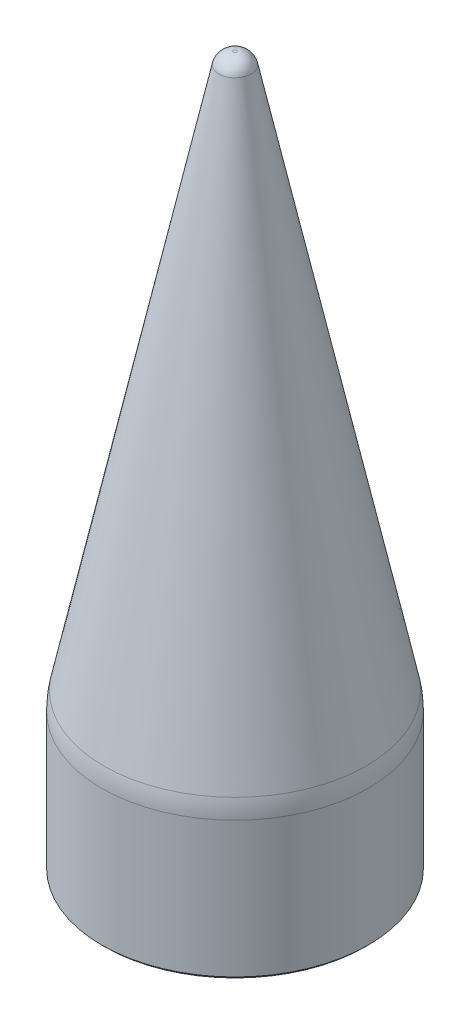
ISO-10303-21;
HEADER;
FILE_DESCRIPTION(('STEP AP214'),'2;1');
FILE_NAME('part.step','',(''),(''),'','','');
FILE_SCHEMA(('AUTOMOTIVE_DESIGN { 1 0 10303 214 1 1 1 1 }'));
ENDSEC;
DATA;
#1=APPLICATION_CONTEXT('core data for automotive mechanical design processes');
#2=APPLICATION_PROTOCOL_DEFINITION('international standard','automotive_design',2000,#1);
#3=PRODUCT_CONTEXT('',#1,'mechanical');
#4=PRODUCT('Part','Part','',(#3));
#5=PRODUCT_RELATED_PRODUCT_CATEGORY('part','',(#4));
#6=PRODUCT_DEFINITION_FORMATION('','',#4);
#7=PRODUCT_DEFINITION_CONTEXT('part definition',#1,'design');
#8=PRODUCT_DEFINITION('design','',#6,#7);
#9=PRODUCT_DEFINITION_SHAPE('','',#8);
#10=(LENGTH_UNIT() NAMED_UNIT(*) SI_UNIT(.MILLI.,.METRE.));
#11=(NAMED_UNIT(*) PLANE_ANGLE_UNIT() SI_UNIT($,.RADIAN.));
#12=(NAMED_UNIT(*) SI_UNIT($,.STERADIAN.) SOLID_ANGLE_UNIT());
#13=UNCERTAINTY_MEASURE_WITH_UNIT(LENGTH_MEASURE(1.E-05),#10,'distance_accuracy_value','');
#14=(GEOMETRIC_REPRESENTATION_CONTEXT(3) GLOBAL_UNCERTAINTY_ASSIGNED_CONTEXT((#13)) GLOBAL_UNIT_ASSIGNED_CONTEXT((#10,
#11,#12)) REPRESENTATION_CONTEXT('',''));
#15=CARTESIAN_POINT('',(0.,0.,0.));
#16=DIRECTION('',(0.,0.,1.));
#17=DIRECTION('',(1.,0.,0.));
#18=AXIS2_PLACEMENT_3D('',#15,#16,#17);
#19=CARTESIAN_POINT('',(0.,50.,0.));
#20=DIRECTION('',(0.,-1.,0.));
#21=DIRECTION('',(0.,0.,-1.));
#22=AXIS2_PLACEMENT_3D('',#19,#20,#21);
#23=CYLINDRICAL_SURFACE('',#22,45.);
#24=CARTESIAN_POINT('',(0.,0.999999999999973,0.));
#25=DIRECTION('',(0.,1.,0.));
#26=DIRECTION('',(0.,0.,1.));
#27=AXIS2_PLACEMENT_3D('',#24,#25,#26);
#28=CIRCLE('',#27,45.);
#29=CARTESIAN_POINT('',(0.,0.999999999999973,45.));
#30=VERTEX_POINT('',#29);
#31=EDGE_CURVE('E51',#30,#30,#28,.T.);
#32=ORIENTED_EDGE('',*,*,#31,.T.);
#33=EDGE_LOOP('',(#32));
#34=FACE_BOUND('',#33,.T.);
#35=CARTESIAN_POINT('',(0.,46.8468729420297,0.));
#36=DIRECTION('',(0.,-1.,0.));
#37=DIRECTION('',(0.,0.,-1.));
#38=AXIS2_PLACEMENT_3D('',#35,#36,#37);
#39=CIRCLE('',#38,45.);
#40=CARTESIAN_POINT('',(0.,46.8468729420297,-45.));
#41=VERTEX_POINT('',#40);
#42=EDGE_CURVE('E56',#41,#41,#39,.T.);
#43=ORIENTED_EDGE('',*,*,#42,.T.);
#44=EDGE_LOOP('',(#43));
#45=FACE_BOUND('',#44,.T.);
#46=ADVANCED_FACE('F35',(#34,#45),#23,.T.);
#47=CARTESIAN_POINT('',(0.,0.,0.));
#48=DIRECTION('',(0.,1.,0.));
#49=DIRECTION('',(0.,0.,1.));
#50=AXIS2_PLACEMENT_3D('',#47,#48,#49);
#51=PLANE('',#50);
#52=CARTESIAN_POINT('',(0.,0.,0.));
#53=DIRECTION('',(0.,1.,0.));
#54=DIRECTION('',(0.,0.,1.));
#55=AXIS2_PLACEMENT_3D('',#52,#53,#54);
#56=CIRCLE('',#55,44.);
#57=CARTESIAN_POINT('',(0.,0.,44.));
#58=VERTEX_POINT('',#57);
#59=EDGE_CURVE('E43',#58,#58,#56,.F.);
#60=ORIENTED_EDGE('',*,*,#59,.T.);
#61=EDGE_LOOP('',(#60));
#62=FACE_BOUND('',#61,.T.);
#63=CARTESIAN_POINT('',(0.,0.,0.));
#64=DIRECTION('',(0.,1.,0.));
#65=DIRECTION('',(0.,0.,1.));
#66=AXIS2_PLACEMENT_3D('',#63,#64,#65);
#67=CIRCLE('',#66,38.5);
#68=CARTESIAN_POINT('',(0.,0.,38.5));
#69=VERTEX_POINT('',#68);
#70=EDGE_CURVE('E47',#69,#69,#67,.T.);
#71=ORIENTED_EDGE('',*,*,#70,.T.);
#72=EDGE_LOOP('',(#71));
#73=FACE_BOUND('',#72,.T.);
#74=ADVANCED_FACE('F110',(#62,#73),#51,.F.);
#75=CARTESIAN_POINT('',(0.,50.,0.));
#76=DIRECTION('',(0.,-1.,0.));
#77=DIRECTION('',(0.,0.,-1.));
#78=AXIS2_PLACEMENT_3D('',#75,#76,#77);
#79=CYLINDRICAL_SURFACE('',#78,37.5);
#80=CARTESIAN_POINT('',(0.,0.999999999999994,0.));
#81=DIRECTION('',(0.,1.,0.));
#82=DIRECTION('',(0.,0.,1.));
#83=AXIS2_PLACEMENT_3D('',#80,#81,#82);
#84=CIRCLE('',#83,37.5);
#85=CARTESIAN_POINT('',(0.,0.999999999999994,37.5));
#86=VERTEX_POINT('',#85);
#87=EDGE_CURVE('E10',#86,#86,#84,.F.);
#88=ORIENTED_EDGE('',*,*,#87,.T.);
#89=EDGE_LOOP('',(#88));
#90=FACE_BOUND('',#89,.T.);
#91=CARTESIAN_POINT('',(0.,32.5,-37.5));
#92=CARTESIAN_POINT('',(0.208483315310918,32.5000041540685,-37.5000021097477));
#93=CARTESIAN_POINT('',(0.41691460283817,32.4913047004498,-37.4982583792321));
#94=CARTESIAN_POINT('',(0.832334416575862,32.4565840093247,-37.4913367448348));
#95=CARTESIAN_POINT('',(1.03932269333409,32.4305598484331,-37.4861582613707));
#96=CARTESIAN_POINT('',(1.45040572618121,32.361372155863,-37.4725053637865));
#97=CARTESIAN_POINT('',(1.65449893033555,32.3181997664587,-37.4640292463569));
#98=CARTESIAN_POINT('',(2.05831663415844,32.2150380210379,-37.4440143844082));
#99=CARTESIAN_POINT('',(2.25803949899806,32.1550424840573,-37.4324745143239));
#100=CARTESIAN_POINT('',(2.65137476573173,32.018794387103,-37.4066706680657));
#101=CARTESIAN_POINT('',(2.84499501234896,31.9425637644025,-37.3924103704889));
#102=CARTESIAN_POINT('',(3.22514992041127,31.7743360493843,-37.3615416354369));
#103=CARTESIAN_POINT('',(3.41168193609257,31.6823331391449,-37.3449323318815));
#104=CARTESIAN_POINT('',(3.77624624960627,31.4832921177685,-37.3098310017853));
#105=CARTESIAN_POINT('',(3.95428233017419,31.3762607831828,-37.2913398248392));
#106=CARTESIAN_POINT('',(4.30082942089902,31.1478411800004,-37.2529633108609));
#107=CARTESIAN_POINT('',(4.46933678948473,31.0264474766386,-37.2330774472415));
#108=CARTESIAN_POINT('',(4.7975608015667,30.7686623125843,-37.1922180702349));
#109=CARTESIAN_POINT('',(4.95715122717416,30.6321117099993,-37.1712345389031));
#110=CARTESIAN_POINT('',(5.26437243600154,30.3460691052754,-37.1289704003494));
#111=CARTESIAN_POINT('',(5.41199773974933,30.1965712379913,-37.107689662192));
#112=CARTESIAN_POINT('',(5.69422181145278,29.8856848230648,-37.0654313950635));
#113=CARTESIAN_POINT('',(5.82881953812857,29.7242953267504,-37.0444538904434));
#114=CARTESIAN_POINT('',(6.08399294654521,29.3907964837525,-37.003401572794));
#115=CARTESIAN_POINT('',(6.20457494551161,29.2186920206983,-36.9833263556041));
#116=CARTESIAN_POINT('',(6.43202344628043,28.8631632785979,-36.9444517958174));
#117=CARTESIAN_POINT('',(6.5387479845296,28.6796466001033,-36.9256664669901));
#118=CARTESIAN_POINT('',(6.73629180278303,28.3041431055097,-36.8901402321636));
#119=CARTESIAN_POINT('',(6.82711718222068,28.1121595731137,-36.8733985429072));
#120=CARTESIAN_POINT('',(6.99224936665368,27.7209449341102,-36.8424417389775));
#121=CARTESIAN_POINT('',(7.06655102254029,27.5217115907653,-36.8282274121546));
#122=CARTESIAN_POINT('',(7.19799039974723,27.1175618458963,-36.8027637397732));
#123=CARTESIAN_POINT('',(7.25513494622282,26.9126477397282,-36.7915132154231));
#124=CARTESIAN_POINT('',(7.35122233290873,26.5011967721759,-36.7724339827146));
#125=CARTESIAN_POINT('',(7.39038768714153,26.2947138026533,-36.7645635253232));
#126=CARTESIAN_POINT('',(7.45125146019002,25.8791646271135,-36.7522763647667));
#127=CARTESIAN_POINT('',(7.47295640337694,25.6700994156717,-36.747858371549));
#128=CARTESIAN_POINT('',(7.49874712966212,25.25082040669,-36.7426042295188));
#129=CARTESIAN_POINT('',(7.50283126903194,25.0406065038278,-36.7417684148642));
#130=CARTESIAN_POINT('',(7.49334210297715,24.6205953310939,-36.7437048720291));
#131=CARTESIAN_POINT('',(7.47976894556144,24.4107980577447,-36.7464771136048));
#132=CARTESIAN_POINT('',(7.43541935800376,23.996352887894,-36.7554763169571));
#133=CARTESIAN_POINT('',(7.40490897147401,23.7916752926596,-36.7616498416296));
#134=CARTESIAN_POINT('',(7.32710240830468,23.3855883202341,-36.7772367471033));
#135=CARTESIAN_POINT('',(7.27980041213413,23.1841801014617,-36.7866512511086));
#136=CARTESIAN_POINT('',(7.16879628734338,22.7861730877336,-36.808444057063));
#137=CARTESIAN_POINT('',(7.10509954425792,22.5895727366129,-36.8208213856562));
#138=CARTESIAN_POINT('',(6.96175109954607,22.2023841595395,-36.8481932199925));
#139=CARTESIAN_POINT('',(6.88209343903769,22.0117982098679,-36.8631887029329));
#140=CARTESIAN_POINT('',(6.7068618946748,21.6368007892246,-36.8954737930672));
#141=CARTESIAN_POINT('',(6.61118970163631,21.4524364726351,-36.9127774272521));
#142=CARTESIAN_POINT('',(6.40493802768173,21.0923359023617,-36.9491235700507));
#143=CARTESIAN_POINT('',(6.29435307738543,20.9166028466781,-36.9681667158144));
#144=CARTESIAN_POINT('',(6.05910323823583,20.5750414331419,-37.007451680742));
#145=CARTESIAN_POINT('',(5.93444210655371,20.4092104502405,-37.0276931793623));
#146=CARTESIAN_POINT('',(5.67181233229327,20.0884289005604,-37.0688307465389));
#147=CARTESIAN_POINT('',(5.53383874135229,19.9334824169185,-37.0897270565307));
#148=CARTESIAN_POINT('',(5.24299247341352,19.6329217356562,-37.1319673147738));
#149=CARTESIAN_POINT('',(5.08989980615945,19.4875205270198,-37.1533126540753));
#150=CARTESIAN_POINT('',(4.77190807366214,19.2100573720609,-37.1954919452116));
#151=CARTESIAN_POINT('',(4.60700486722731,19.0780001441249,-37.2163257141993));
#152=CARTESIAN_POINT('',(4.26658345159893,18.8282233427537,-37.2568871237155));
#153=CARTESIAN_POINT('',(4.09106680895753,18.7105016610731,-37.2766149266612));
#154=CARTESIAN_POINT('',(3.73059642031793,18.4902177213366,-37.3144139195139));
#155=CARTESIAN_POINT('',(3.54564278214968,18.3876552901189,-37.332485128343));
#156=CARTESIAN_POINT('',(3.16724119278212,18.1982778815963,-37.3664920321893));
#157=CARTESIAN_POINT('',(2.97377888610105,18.111490893156,-37.3824239187797));
#158=CARTESIAN_POINT('',(2.58009570605891,17.9545765312727,-37.4116565757603));
#159=CARTESIAN_POINT('',(2.37987720548218,17.8844433771173,-37.4249582588515));
#160=CARTESIAN_POINT('',(1.9740391522938,17.7613442672657,-37.4485578358328));
#161=CARTESIAN_POINT('',(1.76841919013666,17.7083796173918,-37.458855501234));
#162=CARTESIAN_POINT('',(1.35329640920947,17.6200529231699,-37.4761489474015));
#163=CARTESIAN_POINT('',(1.143793645637,17.584690628787,-37.4831447750692));
#164=CARTESIAN_POINT('',(0.726022872298726,17.5323056744515,-37.4935435942351));
#165=CARTESIAN_POINT('',(0.517793904389698,17.5149829602067,-37.4970053485391));
#166=CARTESIAN_POINT('',(0.100514006223325,17.49776594654,-37.5004459103632));
#167=CARTESIAN_POINT('',(-0.108537184557892,17.4978777065345,-37.5004235069515));
#168=CARTESIAN_POINT('',(-0.525819777437648,17.5155419214433,-37.4968937200496));
#169=CARTESIAN_POINT('',(-0.7340513675432,17.5330901105013,-37.493387188958));
#170=CARTESIAN_POINT('',(-1.14824650562539,17.5854800282024,-37.4829887885253));
#171=CARTESIAN_POINT('',(-1.35421000042644,17.620322161424,-37.4760968399849));
#172=CARTESIAN_POINT('',(-1.76054367551311,17.7066306751465,-37.4591973333901));
#173=CARTESIAN_POINT('',(-1.96094756464056,17.7579441375863,-37.4492184637627));
#174=CARTESIAN_POINT('',(-2.35668278023705,17.8768872868282,-37.4263988505881));
#175=CARTESIAN_POINT('',(-2.55201414686694,17.9445168444068,-37.4135581297068));
#176=CARTESIAN_POINT('',(-2.93628621963515,18.0955920712157,-37.3853627122177));
#177=CARTESIAN_POINT('',(-3.12522651450326,18.1790387560167,-37.3700078541931));
#178=CARTESIAN_POINT('',(-3.49543705856643,18.3611390366796,-37.3371993875037));
#179=CARTESIAN_POINT('',(-3.67670733322947,18.4597925820425,-37.3197457858083));
#180=CARTESIAN_POINT('',(-4.03258484683882,18.6729302921012,-37.2829808336499));
#181=CARTESIAN_POINT('',(-4.20708129122912,18.7875959480649,-37.2636490923871));
#182=CARTESIAN_POINT('',(-4.54576684050287,19.0309571104882,-37.2238508628629));
#183=CARTESIAN_POINT('',(-4.70995950266232,19.1596477325112,-37.2033847708714));
#184=CARTESIAN_POINT('',(-5.02708957326882,19.4302744718869,-37.1618616507606));
#185=CARTESIAN_POINT('',(-5.1800218361536,19.572216578281,-37.1408043584827));
#186=CARTESIAN_POINT('',(-5.47348023494801,19.8682903644741,-37.0986924987934));
#187=CARTESIAN_POINT('',(-5.61401078147505,20.0224176733845,-37.0776379330941));
#188=CARTESIAN_POINT('',(-5.88388008800991,20.3443836825924,-37.0357786000378));
#189=CARTESIAN_POINT('',(-6.0130096061901,20.5123990294279,-37.0149828796051));
#190=CARTESIAN_POINT('',(-6.2566080498131,20.8587839843666,-36.9745872135942));
#191=CARTESIAN_POINT('',(-6.37108235596721,21.0371497571181,-36.9549868305356));
#192=CARTESIAN_POINT('',(-6.58463755429622,21.4031332103442,-36.9175339181867));
#193=CARTESIAN_POINT('',(-6.68371296066232,21.5907541567303,-36.8996820126197));
#194=CARTESIAN_POINT('',(-6.86564665357399,21.9738084803757,-36.8662644264114));
#195=CARTESIAN_POINT('',(-6.94851127514729,22.169238769714,-36.8506978532788));
#196=CARTESIAN_POINT('',(-7.09707091203924,22.5656285544041,-36.822374711348));
#197=CARTESIAN_POINT('',(-7.16284756433133,22.7665564937527,-36.8096048292481));
#198=CARTESIAN_POINT('',(-7.27721885454303,23.1733349084955,-36.7871646774489));
#199=CARTESIAN_POINT('',(-7.32581990145493,23.3791835170894,-36.777493251702));
#200=CARTESIAN_POINT('',(-7.40548466479412,23.794393694891,-36.7615349291007));
#201=CARTESIAN_POINT('',(-7.43654704315243,24.0037555308772,-36.7552482904819));
#202=CARTESIAN_POINT('',(-7.48087232675321,24.4244304399162,-36.7462523700107));
#203=CARTESIAN_POINT('',(-7.49413548447293,24.6357434852487,-36.7435430374152));
#204=CARTESIAN_POINT('',(-7.50267395939909,25.0548676279124,-36.7418004440825));
#205=CARTESIAN_POINT('',(-7.49827463763881,25.262671892806,-36.7427006907782));
#206=CARTESIAN_POINT('',(-7.47224940255876,25.6772270201438,-36.7480021903901));
#207=CARTESIAN_POINT('',(-7.45061750423539,25.883977491486,-36.7524046596538));
#208=CARTESIAN_POINT('',(-7.39030407682712,26.2947943254336,-36.764580089633));
#209=CARTESIAN_POINT('',(-7.35162898025213,26.4988616708182,-36.7723517787065));
#210=CARTESIAN_POINT('',(-7.2575176239004,26.9030253797146,-36.7910415327967));
#211=CARTESIAN_POINT('',(-7.20207515050235,27.1031202417678,-36.8019607641531));
#212=CARTESIAN_POINT('',(-7.07502941214461,27.4973455610415,-36.8265954172696));
#213=CARTESIAN_POINT('',(-7.00346929039375,27.691490397237,-36.8403033649738));
#214=CARTESIAN_POINT('',(-6.84463592993069,28.0730548412819,-36.8701435324314));
#215=CARTESIAN_POINT('',(-6.75736214620025,28.2604742155924,-36.8862758362687));
#216=CARTESIAN_POINT('',(-6.56772825515018,28.6273386300217,-36.920512239071));
#217=CARTESIAN_POINT('',(-6.46536748970106,28.8067833218215,-36.938616424045));
#218=CARTESIAN_POINT('',(-6.24627716794432,29.1565131123068,-36.9762947245103));
#219=CARTESIAN_POINT('',(-6.12954740927814,29.3267980819474,-36.9958688607013));
#220=CARTESIAN_POINT('',(-5.88040938896428,29.6599115481088,-37.036292677648));
#221=CARTESIAN_POINT('',(-5.74776822725967,29.8225639586269,-37.0571583909656));
#222=CARTESIAN_POINT('',(-5.46935687274789,30.1361560640851,-37.0992715695963));
#223=CARTESIAN_POINT('',(-5.32358682811719,30.2870958911811,-37.1205190305987));
#224=CARTESIAN_POINT('',(-5.01983590048018,30.5763108610648,-37.1628142700838));
#225=CARTESIAN_POINT('',(-4.86184989799891,30.7145806404544,-37.1838619606524));
#226=CARTESIAN_POINT('',(-4.53484188370158,30.9773902612031,-37.2251575434954));
#227=CARTESIAN_POINT('',(-4.36582394152433,31.1019351205583,-37.2454057263305));
#228=CARTESIAN_POINT('',(-4.01594005631662,31.3377609138704,-37.2847629016773));
#229=CARTESIAN_POINT('',(-3.83496530621429,31.4488829727834,-37.3038571206718));
#230=CARTESIAN_POINT('',(-3.46416700040671,31.6554166107258,-37.3401156271458));
#231=CARTESIAN_POINT('',(-3.27434673715674,31.750833976323,-37.3572806247256));
#232=CARTESIAN_POINT('',(-2.88723498954162,31.9252367552955,-37.389190267871));
#233=CARTESIAN_POINT('',(-2.68994810908542,32.0042321054608,-37.4039363759352));
#234=CARTESIAN_POINT('',(-2.28927663717611,32.1452315210594,-37.4305965678313));
#235=CARTESIAN_POINT('',(-2.08589322886263,32.2072388599358,-37.442511197206));
#236=CARTESIAN_POINT('',(-1.57380323523498,32.3398346907894,-37.46821309223));
#237=CARTESIAN_POINT('',(-1.26218624106522,32.3998147160176,-37.4800712854718));
#238=CARTESIAN_POINT('',(-0.633672680464612,32.479893579184,-37.4959630118578));
#239=CARTESIAN_POINT('',(-0.316776282623468,32.4999936881742,-37.4999967943813));
#240=CARTESIAN_POINT('',(0.,32.5,-37.5));
#241=B_SPLINE_CURVE_WITH_KNOTS('',3,(#91,#92,#93,#94,#95,#96,#97,#98,#99,#100,#101,#102,#103,
#104,#105,#106,#107,#108,#109,#110,#111,#112,#113,#114,#115,#116,#117,#118,#119,#120,#121,#122,
#123,#124,#125,#126,#127,#128,#129,#130,#131,#132,#133,#134,#135,#136,#137,#138,#139,#140,#141,
#142,#143,#144,#145,#146,#147,#148,#149,#150,#151,#152,#153,#154,#155,#156,#157,#158,#159,#160,
#161,#162,#163,#164,#165,#166,#167,#168,#169,#170,#171,#172,#173,#174,#175,#176,#177,#178,#179,
#180,#181,#182,#183,#184,#185,#186,#187,#188,#189,#190,#191,#192,#193,#194,#195,#196,#197,#198,
#199,#200,#201,#202,#203,#204,#205,#206,#207,#208,#209,#210,#211,#212,#213,#214,#215,#216,#217,
#218,#219,#220,#221,#222,#223,#224,#225,#226,#227,#228,#229,#230,#231,#232,#233,#234,#235,#236,
#237,#238,#239,#240),.UNSPECIFIED.,.T.,.F.,(4,2,2,2,2,2,2,2,2,2,2,2,2,2,2,2,2,2,2,2,2,2,2,2,2,2,
2,2,2,2,2,2,2,2,2,2,2,2,2,2,2,2,2,2,2,2,2,2,2,2,2,2,2,2,2,2,2,2,2,2,2,2,2,2,2,2,2,2,2,2,2,2,2,2,
4),(0.,0.6251717882362,1.25044909521505,1.87604980309508,2.50188066372339,3.12687119053535,
3.75209275553386,4.3770332983578,5.00221108155898,5.63471814112609,6.2675132419863,
6.90035887976466,7.53291816354519,8.17151772410144,8.80987175766558,9.44842443669745,
10.0867227597562,10.7168930013115,11.3468276598176,11.9768210794987,12.6068092184148,
13.2271708322685,13.84774765741,14.4681208879416,15.0887261629095,15.7132911534557,
16.3380858346729,16.9627141400789,17.58757552662,18.2234659200914,18.8595803811642,
19.4956011793064,20.1316147117104,20.7687458767553,21.4056555628661,22.0426136804386,
22.6795627500027,23.3057394185827,23.9321337176781,24.5583748059139,25.1846305452698,
25.8052326454105,26.4258298305379,27.0464668758717,27.6671018602448,28.2954494412825,
28.9235788845368,29.5519935995908,30.1801839132975,30.8181921574725,31.4559654788076,
32.093965486638,32.7317156696007,33.3663605438108,34.000768352752,34.635224555717,
35.2696717589929,35.8924859130345,36.5155164694753,37.1383120804368,37.7613387691546,
38.3827171721884,39.0041171314846,39.6255442057296,40.2469800325345,40.8789855974446,
41.5109840302459,42.1432487721929,42.7752815781831,43.414183802787,44.05285008723,
44.6911287892514,45.3292844138289,46.2792208967571,47.2291271028397),.UNSPECIFIED.);
#242=CARTESIAN_POINT('',(0.,32.5,-37.5));
#243=VERTEX_POINT('',#242);
#244=EDGE_CURVE('E69',#243,#243,#241,.T.);
#245=ORIENTED_EDGE('',*,*,#244,.T.);
#246=EDGE_LOOP('',(#245));
#247=FACE_BOUND('',#246,.T.);
#248=CARTESIAN_POINT('',(7.5,25.,36.7423461417477));
#249=CARTESIAN_POINT('',(7.50000416888306,25.2084364146579,36.7423438711312));
#250=CARTESIAN_POINT('',(7.49130858606999,25.4168207836695,36.744123102313));
#251=CARTESIAN_POINT('',(7.45660375186463,25.8321454807703,36.7511823038879));
#252=CARTESIAN_POINT('',(7.43059157331427,26.0390855587428,36.7564628661375));
#253=CARTESIAN_POINT('',(7.36143664001891,26.4500711977801,36.7703751001836));
#254=CARTESIAN_POINT('',(7.31828495477671,26.6541151923513,36.7790085189254));
#255=CARTESIAN_POINT('',(7.21517429327654,27.0578333914909,36.7993752788352));
#256=CARTESIAN_POINT('',(7.15520913028826,27.2575059583257,36.8111097609868));
#257=CARTESIAN_POINT('',(7.01903435994788,27.6507342106799,36.8373173878891));
#258=CARTESIAN_POINT('',(6.94284729365554,27.8442979604709,36.8517867293291));
#259=CARTESIAN_POINT('',(6.77471728394722,28.2243445619957,36.8830654239203));
#260=CARTESIAN_POINT('',(6.68276852834637,28.4108247705468,36.8998756398477));
#261=CARTESIAN_POINT('',(6.48384388840543,28.7752950082353,36.9353484574512));
#262=CARTESIAN_POINT('',(6.37687468405593,28.953288764641,36.9540102346126));
#263=CARTESIAN_POINT('',(6.14858570405641,29.2997617060979,36.9926789547402));
#264=CARTESIAN_POINT('',(6.02726057006091,29.4682373036148,37.012686398766));
#265=CARTESIAN_POINT('',(5.76953907601067,29.7965090300723,37.053740006991));
#266=CARTESIAN_POINT('',(5.63297541254146,29.9561726128594,37.0747959332937));
#267=CARTESIAN_POINT('',(5.34690382154061,30.2635266004951,37.117132549567));
#268=CARTESIAN_POINT('',(5.1973911298605,30.4112125595611,37.1384133197112));
#269=CARTESIAN_POINT('',(4.88649262762247,30.6935291468603,37.1805969565699));
#270=CARTESIAN_POINT('',(4.72510824275444,30.8281613382537,37.2014998682877));
#271=CARTESIAN_POINT('',(4.39153242302179,31.0834658793489,37.242350535719));
#272=CARTESIAN_POINT('',(4.21934079264067,31.2041379763828,37.2622982741407));
#273=CARTESIAN_POINT('',(3.86376611382213,31.4316598252031,37.3008520417869));
#274=CARTESIAN_POINT('',(3.6802984669466,31.5383796710862,37.319444833365));
#275=CARTESIAN_POINT('',(3.30482093361057,31.7359604993311,37.3545674263251));
#276=CARTESIAN_POINT('',(3.11281098147141,31.8268213597325,37.3710972118416));
#277=CARTESIAN_POINT('',(2.72161437991565,31.9919875868872,37.4016216149092));
#278=CARTESIAN_POINT('',(2.52242815699636,32.0662939356224,37.4156163828236));
#279=CARTESIAN_POINT('',(2.11830498237595,32.1977726629787,37.4406698991638));
#280=CARTESIAN_POINT('',(1.91336826559403,32.2549457404172,37.4517287673345));
#281=CARTESIAN_POINT('',(1.5019257981091,32.3510726788252,37.4704693699331));
#282=CARTESIAN_POINT('',(1.29547495766648,32.3902534324682,37.4781930837008));
#283=CARTESIAN_POINT('',(0.879992245465719,32.4511529178417,37.4902492267584));
#284=CARTESIAN_POINT('',(0.670961362288238,32.4728781391776,37.4945829163733));
#285=CARTESIAN_POINT('',(0.25175008784817,32.4987150819961,37.4997408927118));
#286=CARTESIAN_POINT('',(0.0415695864046078,32.5028250845093,37.5005648369393));
#287=CARTESIAN_POINT('',(-0.378378121635777,32.4933931057749,37.4986788926519));
#288=CARTESIAN_POINT('',(-0.588145331419399,32.4798512611744,37.495969031493));
#289=CARTESIAN_POINT('',(-1.00271256468797,32.4355495144783,37.4871569376717));
#290=CARTESIAN_POINT('',(-1.20754057454177,32.4050410726236,37.4811042574403));
#291=CARTESIAN_POINT('',(-1.61392928838902,32.3272129238849,37.4658056709803));
#292=CARTESIAN_POINT('',(-1.81548883360831,32.2798873854129,37.4565586570982));
#293=CARTESIAN_POINT('',(-2.21379484164763,32.1688105859947,37.4351289529834));
#294=CARTESIAN_POINT('',(-2.41054289345435,32.1050648302471,37.422947246752));
#295=CARTESIAN_POINT('',(-2.79802009081444,31.9615933246218,37.3959732991122));
#296=CARTESIAN_POINT('',(-2.98874695996222,31.8818616127902,37.3811800839897));
#297=CARTESIAN_POINT('',(-3.36393041281588,31.7064970693,37.3492922246274));
#298=CARTESIAN_POINT('',(-3.54834316211299,31.6107728446627,37.3321844668903));
#299=CARTESIAN_POINT('',(-3.90852978871107,31.4044123559534,37.2961951604843));
#300=CARTESIAN_POINT('',(-4.08430046396759,31.2937706206552,37.2773129617854));
#301=CARTESIAN_POINT('',(-4.42593341500294,31.0583919162592,37.2382956002526));
#302=CARTESIAN_POINT('',(-4.59179834289953,30.9336587460315,37.2181607757652));
#303=CARTESIAN_POINT('',(-4.91260451432266,30.6709233823043,37.1771772929586));
#304=CARTESIAN_POINT('',(-5.06754160178606,30.5329161871078,37.1563283674842));
#305=CARTESIAN_POINT('',(-5.51944219538523,30.095413503884,37.0928451556847));
#306=CARTESIAN_POINT('',(-5.79783371878936,29.7763343643087,37.0499487050956));
#307=CARTESIAN_POINT('',(-6.29721235573191,29.0955234148858,36.9683588989555));
#308=CARTESIAN_POINT('',(-6.51819838353139,28.7337907984999,36.9296656229092));
#309=CARTESIAN_POINT('',(-6.80201732922663,28.1666357157391,36.8780658652673));
#310=CARTESIAN_POINT('',(-6.88878152307138,27.9731594323108,36.8619184946822));
#311=CARTESIAN_POINT('',(-7.04567311170368,27.5794052075172,36.8322534188069));
#312=CARTESIAN_POINT('',(-7.11580662044689,27.3791297967727,36.8187347474552));
#313=CARTESIAN_POINT('',(-7.23889176046709,26.9731838863595,36.7947330039885));
#314=CARTESIAN_POINT('',(-7.29184201978384,26.7675129573133,36.7842501742709));
#315=CARTESIAN_POINT('',(-7.38013402836917,26.3522817222655,36.7666377798805));
#316=CARTESIAN_POINT('',(-7.41547608778873,26.1427214848375,36.7595081561442));
#317=CARTESIAN_POINT('',(-7.46780572464481,25.7248800781463,36.7489126044745));
#318=CARTESIAN_POINT('',(-7.48509721974196,25.5166384485021,36.7453860342497));
#319=CARTESIAN_POINT('',(-7.50224699903781,25.0994080333679,36.7418884646793));
#320=CARTESIAN_POINT('',(-7.50210536033542,24.8904192511862,36.7419174496091));
#321=CARTESIAN_POINT('',(-7.48439019020165,24.4732230555722,36.745530125564));
#322=CARTESIAN_POINT('',(-7.466817448117,24.2650156071865,36.7491136556258));
#323=CARTESIAN_POINT('',(-7.41438427838583,23.8508837651491,36.7597282287199));
#324=CARTESIAN_POINT('',(-7.37952428064919,23.6449593148526,36.7667591860195));
#325=CARTESIAN_POINT('',(-7.29321258801596,23.2388255505347,36.7839769968858));
#326=CARTESIAN_POINT('',(-7.24192341204834,23.038580346556,36.79413290093));
#327=CARTESIAN_POINT('',(-7.12305600810819,22.6431600203879,36.8173292925947));
#328=CARTESIAN_POINT('',(-7.05547795411859,22.4479848440698,36.8303697494048));
#329=CARTESIAN_POINT('',(-6.90451865943923,22.0639832179178,36.8589679784105));
#330=CARTESIAN_POINT('',(-6.82113360263619,21.8751583141492,36.874526358348));
#331=CARTESIAN_POINT('',(-6.63920649281698,21.505231084097,36.9077157092581));
#332=CARTESIAN_POINT('',(-6.54066963283552,21.3241261389829,36.9253459696411));
#333=CARTESIAN_POINT('',(-6.32769039212786,20.968389325832,36.9624426845076));
#334=CARTESIAN_POINT('',(-6.21305267273301,20.7938766291241,36.9819305678126));
#335=CARTESIAN_POINT('',(-5.96974312912245,20.4551527701508,37.021984777654));
#336=CARTESIAN_POINT('',(-5.84107620263662,20.2909380441012,37.0425507265339));
#337=CARTESIAN_POINT('',(-5.57049051712769,19.9737579026646,37.0842065549336));
#338=CARTESIAN_POINT('',(-5.42856580634257,19.8207975952952,37.1052966666152));
#339=CARTESIAN_POINT('',(-5.13251847009921,19.5272777471179,37.1474036136734));
#340=CARTESIAN_POINT('',(-4.97840022495653,19.386713791164,37.1684204725577));
#341=CARTESIAN_POINT('',(-4.65642357979864,19.1167571246987,37.2101394520875));
#342=CARTESIAN_POINT('',(-4.48838697318366,18.9875752828278,37.2308313988001));
#343=CARTESIAN_POINT('',(-4.14194890281579,18.7438753867337,37.2709625573015));
#344=CARTESIAN_POINT('',(-3.96355128060624,18.6293519474531,37.2904022278278));
#345=CARTESIAN_POINT('',(-3.59749663589544,18.415704810308,37.3274947839094));
#346=CARTESIAN_POINT('',(-3.40983636318614,18.3165865693819,37.3451470355443));
#347=CARTESIAN_POINT('',(-3.02669908113935,18.1345754183908,37.3781492748115));
#348=CARTESIAN_POINT('',(-2.83122516128976,18.0516761703431,37.3935001612104));
#349=CARTESIAN_POINT('',(-2.4348475842328,17.9030940649779,37.4213946059885));
#350=CARTESIAN_POINT('',(-2.23397873952249,17.8373211072895,37.433952803345));
#351=CARTESIAN_POINT('',(-1.82732426462605,17.7229483579852,37.4560052545818));
#352=CARTESIAN_POINT('',(-1.62154049577426,17.674342171867,37.4655006492201));
#353=CARTESIAN_POINT('',(-1.20646289147207,17.5946566115733,37.4811630314108));
#354=CARTESIAN_POINT('',(-0.997168760431377,17.5635787210765,37.4873297372052));
#355=CARTESIAN_POINT('',(-0.576630889993855,17.51921126296,37.4961561424233));
#356=CARTESIAN_POINT('',(-0.365387176657876,17.5059214579057,37.4988158886578));
#357=CARTESIAN_POINT('',(0.0537583507635774,17.4973155160227,37.5005367830977));
#358=CARTESIAN_POINT('',(0.261653565975836,17.5016872386351,37.4996604268578));
#359=CARTESIAN_POINT('',(0.67639365318575,17.5276725806865,37.4944731265037));
#360=CARTESIAN_POINT('',(0.883238134979877,17.549292192666,37.4901609886755));
#361=CARTESIAN_POINT('',(1.29424507846314,17.6095971056066,37.4782227931976));
#362=CARTESIAN_POINT('',(1.49840853159168,17.6482759040036,37.4705979982722));
#363=CARTESIAN_POINT('',(1.90276596639531,17.7424115851213,37.4522423913064));
#364=CARTESIAN_POINT('',(2.10295844850025,17.7978746822896,37.4415104288898));
#365=CARTESIAN_POINT('',(2.49740730928189,17.9249885193955,37.4172675140841));
#366=CARTESIAN_POINT('',(2.69167725317462,17.9965985231,37.4037635625642));
#367=CARTESIAN_POINT('',(3.07348459301724,18.1555529477126,37.3743275396358));
#368=CARTESIAN_POINT('',(3.26102175889789,18.2428979056954,37.3583953853492));
#369=CARTESIAN_POINT('',(3.62810898865211,18.4326930063356,37.3245335716362));
#370=CARTESIAN_POINT('',(3.8076587352084,18.535143748406,37.3066038329505));
#371=CARTESIAN_POINT('',(4.15758211288054,18.7544298924203,37.2692296403171));
#372=CARTESIAN_POINT('',(4.32795561998058,18.8712654887037,37.2497851659068));
#373=CARTESIAN_POINT('',(4.66108559454234,19.120522774246,37.209580567361));
#374=CARTESIAN_POINT('',(4.82367461225747,19.2531657031343,37.1888042671798));
#375=CARTESIAN_POINT('',(5.13713809457244,19.5315674601186,37.1468009985545));
#376=CARTESIAN_POINT('',(5.28801268862245,19.6773261432405,37.1255740350937));
#377=CARTESIAN_POINT('',(5.57709810761412,19.9810411330052,37.083248670816));
#378=CARTESIAN_POINT('',(5.71530349424999,20.1390026246354,37.0621503288043));
#379=CARTESIAN_POINT('',(5.97798739436149,20.46594824299,37.0206880900568));
#380=CARTESIAN_POINT('',(6.10247091428129,20.6349283135163,37.0003239272917));
#381=CARTESIAN_POINT('',(6.33821557859562,20.9847778358726,36.9606747240084));
#382=CARTESIAN_POINT('',(6.44931341749255,21.1657590491367,36.9414042857583));
#383=CARTESIAN_POINT('',(6.65579832247966,21.5365669182176,36.9047604507093));
#384=CARTESIAN_POINT('',(6.75119117530037,21.7263902827909,36.8873863559738));
#385=CARTESIAN_POINT('',(6.92554566206658,22.1135066733226,36.8550496593228));
#386=CARTESIAN_POINT('',(7.00451731050878,22.3107950594328,36.8400855889132));
#387=CARTESIAN_POINT('',(7.14547084426634,22.7114709971228,36.8130055562009));
#388=CARTESIAN_POINT('',(7.20745601665039,22.9148573602145,36.8008890429296));
#389=CARTESIAN_POINT('',(7.3399637563041,23.4268265327069,36.7747412155111));
#390=CARTESIAN_POINT('',(7.3998950524825,23.7383169277303,36.7626602139541));
#391=CARTESIAN_POINT('',(7.47990932082624,24.3665783752163,36.7464645391191));
#392=CARTESIAN_POINT('',(7.49999366674978,24.6833492452503,36.7423495912045));
#393=CARTESIAN_POINT('',(7.5,25.,36.7423461417477));
#394=B_SPLINE_CURVE_WITH_KNOTS('',3,(#248,#249,#250,#251,#252,#253,#254,#255,#256,#257,#258,
#259,#260,#261,#262,#263,#264,#265,#266,#267,#268,#269,#270,#271,#272,#273,#274,#275,#276,#277,
#278,#279,#280,#281,#282,#283,#284,#285,#286,#287,#288,#289,#290,#291,#292,#293,#294,#295,#296,
#297,#298,#299,#300,#301,#302,#303,#304,#305,#306,#307,#308,#309,#310,#311,#312,#313,#314,#315,
#316,#317,#318,#319,#320,#321,#322,#323,#324,#325,#326,#327,#328,#329,#330,#331,#332,#333,#334,
#335,#336,#337,#338,#339,#340,#341,#342,#343,#344,#345,#346,#347,#348,#349,#350,#351,#352,#353,
#354,#355,#356,#357,#358,#359,#360,#361,#362,#363,#364,#365,#366,#367,#368,#369,#370,#371,#372,
#373,#374,#375,#376,#377,#378,#379,#380,#381,#382,#383,#384,#385,#386,#387,#388,#389,#390,#391,
#392,#393),.UNSPECIFIED.,.T.,.F.,(4,2,2,2,2,2,2,2,2,2,2,2,2,2,2,2,2,2,2,2,2,2,2,2,2,2,2,2,2,2,2,
2,2,2,2,2,2,2,2,2,2,2,2,2,2,2,2,2,2,2,2,2,2,2,2,2,2,2,2,2,2,2,2,2,2,2,2,2,2,2,2,2,4),(0.,
0.625030894508631,1.25016746965897,1.87563019885926,2.50132337764002,3.12615273650951,
3.75121300127287,4.37599616047404,5.00101325976928,5.63373268717076,6.26668589888193,
6.89956322197289,7.53245199790368,8.17086748440241,8.80928788029267,9.44767039621956,
10.0860268707996,10.7160959606607,11.3459306953457,11.9758268906326,12.6057182097737,
13.2265136181107,13.8475245072546,14.4683274607479,15.0893623744882,15.7140760014089,
16.3390193781075,16.9637946783268,17.588806325176,18.8592921496073,20.129802001625,
20.7671155335339,21.4041944047171,22.041324129609,22.6784426316961,23.3046519002412,
23.9308583993443,24.5570365427271,25.1831991147158,25.8033495850553,26.4234934318067,
27.0437871842699,27.6638688130281,28.29225476629,28.9204220422054,29.5488726864328,
30.1770985868854,30.8152211748057,31.4531086586365,32.0912215870135,32.7290846563266,
33.363520880714,33.9977205321829,34.6319738572891,35.2662187163208,35.889303740773,
36.5126053418247,37.1356695599025,37.7589647526104,38.3807047176149,39.0024659082337,
39.6242517776239,40.2460460482707,40.8778821690152,41.5097113066645,42.14181040168,
42.7736781056539,43.4126069261407,44.0512997945507,44.6896020053074,45.3277806102514,
46.2773427513486,47.2268721548975),.UNSPECIFIED.);
#395=CARTESIAN_POINT('',(7.5,25.,36.7423461417477));
#396=VERTEX_POINT('',#395);
#397=EDGE_CURVE('E77',#396,#396,#394,.T.);
#398=ORIENTED_EDGE('',*,*,#397,.T.);
#399=EDGE_LOOP('',(#398));
#400=FACE_BOUND('',#399,.T.);
#401=CARTESIAN_POINT('',(0.,50.,0.));
#402=DIRECTION('',(0.,-1.,0.));
#403=DIRECTION('',(0.,0.,-1.));
#404=AXIS2_PLACEMENT_3D('',#401,#402,#403);
#405=CIRCLE('',#404,37.5);
#406=CARTESIAN_POINT('',(0.,50.,-37.5));
#407=VERTEX_POINT('',#406);
#408=EDGE_CURVE('E68',#407,#407,#405,.T.);
#409=ORIENTED_EDGE('',*,*,#408,.F.);
#410=EDGE_LOOP('',(#409));
#411=FACE_BOUND('',#410,.T.);
#412=ADVANCED_FACE('F82',(#90,#247,#400,#411),#79,.F.);
#413=CARTESIAN_POINT('',(0.,25.,-40.));
#414=DIRECTION('',(0.,0.,1.));
#415=DIRECTION('',(1.,0.,0.));
#416=AXIS2_PLACEMENT_3D('',#413,#414,#415);
#417=CYLINDRICAL_SURFACE('',#416,7.5);
#418=ORIENTED_EDGE('',*,*,#397,.F.);
#419=EDGE_LOOP('',(#418));
#420=FACE_BOUND('',#419,.T.);
#421=ORIENTED_EDGE('',*,*,#244,.F.);
#422=EDGE_LOOP('',(#421));
#423=FACE_BOUND('',#422,.T.);
#424=ADVANCED_FACE('F85',(#420,#423),#417,.T.);
#425=CARTESIAN_POINT('',(0.,50.,0.));
#426=DIRECTION('',(0.,1.,0.));
#427=DIRECTION('',(0.,0.,1.));
#428=AXIS2_PLACEMENT_3D('',#425,#426,#427);
#429=PLANE('',#428);
#430=ORIENTED_EDGE('',*,*,#408,.T.);
#431=EDGE_LOOP('',(#430));
#432=FACE_BOUND('',#431,.T.);
#433=ADVANCED_FACE('F89',(#432),#429,.F.);
#434=CARTESIAN_POINT('',(0.,50.,0.));
#435=DIRECTION('',(0.,-1.,0.));
#436=DIRECTION('',(0.,0.,1.));
#437=AXIS2_PLACEMENT_3D('',#434,#435,#436);
#438=CONICAL_SURFACE('',#437,45.,0.20943951023932);
#439=CARTESIAN_POINT('',(0.,53.0842236665625,0.));
#440=DIRECTION('',(0.,1.,0.));
#441=DIRECTION('',(0.,0.,1.));
#442=AXIS2_PLACEMENT_3D('',#439,#440,#441);
#443=CIRCLE('',#442,44.3444280220142);
#444=CARTESIAN_POINT('',(0.,53.0842236665625,44.3444280220142));
#445=VERTEX_POINT('',#444);
#446=EDGE_CURVE('E59',#445,#445,#443,.T.);
#447=CARTESIAN_POINT('',(0.,236.039558454089,0.));
#448=DIRECTION('',(0.,-1.,0.));
#449=DIRECTION('',(0.,0.,-1.));
#450=AXIS2_PLACEMENT_3D('',#447,#448,#449);
#451=CIRCLE('',#450,5.45607112038971);
#452=CARTESIAN_POINT('',(0.,236.039558454089,5.45607112038971));
#453=VERTEX_POINT('',#452);
#454=EDGE_CURVE('E62',#453,#453,#451,.T.);
#455=CARTESIAN_POINT('',(0.,53.0842236665625,44.3444280220142));
#456=CARTESIAN_POINT('',(0.,54.9900084039325,43.9393409709556));
#457=CARTESIAN_POINT('',(0.,56.8957931413026,43.534253919897));
#458=CARTESIAN_POINT('',(0.,60.7073626160427,42.7240798177798));
#459=CARTESIAN_POINT('',(0.,62.6131473534128,42.3189927667212));
#460=CARTESIAN_POINT('',(0.,66.4247168281529,41.5088186646041));
#461=CARTESIAN_POINT('',(0.,68.330501565523,41.1037316135455));
#462=CARTESIAN_POINT('',(0.,72.1420710402631,40.2935575114283));
#463=CARTESIAN_POINT('',(0.,74.0478557776332,39.8884704603697));
#464=CARTESIAN_POINT('',(0.,77.8594252523733,39.0782963582525));
#465=CARTESIAN_POINT('',(0.,79.7652099897434,38.6732093071939));
#466=CARTESIAN_POINT('',(0.,83.5767794644835,37.8630352050768));
#467=CARTESIAN_POINT('',(0.,85.4825642018536,37.4579481540182));
#468=CARTESIAN_POINT('',(0.,89.2941336765937,36.647774051901));
#469=CARTESIAN_POINT('',(0.,91.1999184139638,36.2426870008424));
#470=CARTESIAN_POINT('',(0.,95.0114878887039,35.4325128987252));
#471=CARTESIAN_POINT('',(0.,96.917272626074,35.0274258476666));
#472=CARTESIAN_POINT('',(0.,100.728842100814,34.2172517455495));
#473=CARTESIAN_POINT('',(0.,102.634626838184,33.8121646944909));
#474=CARTESIAN_POINT('',(0.,106.446196312924,33.0019905923737));
#475=CARTESIAN_POINT('',(0.,108.351981050294,32.5969035413151));
#476=CARTESIAN_POINT('',(0.,112.163550525035,31.7867294391979));
#477=CARTESIAN_POINT('',(0.,114.069335262405,31.3816423881393));
#478=CARTESIAN_POINT('',(0.,117.880904737145,30.5714682860222));
#479=CARTESIAN_POINT('',(0.,119.786689474515,30.1663812349636));
#480=CARTESIAN_POINT('',(0.,123.598258949255,29.3562071328464));
#481=CARTESIAN_POINT('',(0.,125.504043686625,28.9511200817878));
#482=CARTESIAN_POINT('',(0.,129.315613161365,28.1409459796706));
#483=CARTESIAN_POINT('',(0.,131.221397898735,27.7358589286121));
#484=CARTESIAN_POINT('',(0.,135.032967373475,26.9256848264949));
#485=CARTESIAN_POINT('',(0.,136.938752110845,26.5205977754363));
#486=CARTESIAN_POINT('',(0.,140.750321585586,25.7104236733191));
#487=CARTESIAN_POINT('',(0.,142.656106322956,25.3053366222605));
#488=CARTESIAN_POINT('',(0.,146.467675797696,24.4951625201434));
#489=CARTESIAN_POINT('',(0.,148.373460535066,24.0900754690848));
#490=CARTESIAN_POINT('',(0.,152.185030009806,23.2799013669676));
#491=CARTESIAN_POINT('',(0.,154.090814747176,22.874814315909));
#492=CARTESIAN_POINT('',(0.,157.902384221916,22.0646402137918));
#493=CARTESIAN_POINT('',(0.,159.808168959286,21.6595531627332));
#494=CARTESIAN_POINT('',(0.,163.619738434026,20.8493790606161));
#495=CARTESIAN_POINT('',(0.,165.525523171396,20.4442920095575));
#496=CARTESIAN_POINT('',(0.,169.337092646136,19.6341179074403));
#497=CARTESIAN_POINT('',(0.,171.242877383507,19.2290308563817));
#498=CARTESIAN_POINT('',(0.,175.054446858247,18.4188567542645));
#499=CARTESIAN_POINT('',(0.,176.960231595617,18.0137697032059));
#500=CARTESIAN_POINT('',(0.,180.771801070357,17.2035956010888));
#501=CARTESIAN_POINT('',(0.,182.677585807727,16.7985085500302));
#502=CARTESIAN_POINT('',(0.,186.489155282467,15.988334447913));
#503=CARTESIAN_POINT('',(0.,188.394940019837,15.5832473968544));
#504=CARTESIAN_POINT('',(0.,192.206509494577,14.7730732947372));
#505=CARTESIAN_POINT('',(0.,194.112294231947,14.3679862436787));
#506=CARTESIAN_POINT('',(0.,197.923863706687,13.5578121415615));
#507=CARTESIAN_POINT('',(0.,199.829648444058,13.1527250905029));
#508=CARTESIAN_POINT('',(0.,203.641217918798,12.3425509883857));
#509=CARTESIAN_POINT('',(0.,205.547002656168,11.9374639373271));
#510=CARTESIAN_POINT('',(0.,209.358572130908,11.12728983521));
#511=CARTESIAN_POINT('',(0.,211.264356868278,10.7222027841514));
#512=CARTESIAN_POINT('',(0.,215.075926343018,9.91202868203419));
#513=CARTESIAN_POINT('',(0.,216.981711080388,9.5069416309756));
#514=CARTESIAN_POINT('',(0.,220.793280555128,8.69676752885842));
#515=CARTESIAN_POINT('',(0.,222.699065292498,8.29168047779983));
#516=CARTESIAN_POINT('',(0.,226.510634767238,7.48150637568265));
#517=CARTESIAN_POINT('',(0.,228.416419504609,7.07641932462407));
#518=CARTESIAN_POINT('',(0.,232.227988979349,6.26624522250689));
#519=CARTESIAN_POINT('',(0.,234.133773716719,5.86115817144831));
#520=CARTESIAN_POINT('',(0.,236.039558454089,5.45607112038971));
#521=B_SPLINE_CURVE_WITH_KNOTS('',3,(#455,#456,#457,#458,#459,#460,#461,#462,#463,#464,#465,
#466,#467,#468,#469,#470,#471,#472,#473,#474,#475,#476,#477,#478,#479,#480,#481,#482,#483,#484,
#485,#486,#487,#488,#489,#490,#491,#492,#493,#494,#495,#496,#497,#498,#499,#500,#501,#502,#503,
#504,#505,#506,#507,#508,#509,#510,#511,#512,#513,#514,#515,#516,#517,#518,#519,#520),
.UNSPECIFIED.,.F.,.F.,(4,2,2,2,2,2,2,2,2,2,2,2,2,2,2,2,2,2,2,2,2,2,2,2,2,2,2,2,2,2,2,2,4),(0.,
5.84508330626282,11.6901666125256,17.5352499187885,23.3803332250513,29.2254165313141,
35.0704998375769,40.9155831438397,46.7606664501026,52.6057497563654,58.4508330626282,
64.295916368891,70.1409996751538,75.9860829814167,81.8311662876795,87.6762495939423,
93.5213329002051,99.3664162064679,105.211499512731,111.056582818994,116.901666125256,
122.746749431519,128.591832737782,134.436916044045,140.281999350308,146.12708265657,
151.972165962833,157.817249269096,163.662332575359,169.507415881622,175.352499187885,
181.197582494147,187.04266580041),.UNSPECIFIED.);
#522=EDGE_CURVE('BSEAM91',#445,#453,#521,.T.);
#523=ORIENTED_EDGE('',*,*,#446,.T.);
#524=ORIENTED_EDGE('',*,*,#454,.T.);
#525=ORIENTED_EDGE('',*,*,#522,.T.);
#526=ORIENTED_EDGE('',*,*,#522,.F.);
#527=EDGE_LOOP('',(#523,#525,#524,#526));
#528=FACE_BOUND('',#527,.T.);
#529=ADVANCED_FACE('F91',(#528),#438,.T.);
#530=CARTESIAN_POINT('',(0.,240.,0.));
#531=DIRECTION('',(0.,1.,0.));
#532=DIRECTION('',(0.,0.,1.));
#533=AXIS2_PLACEMENT_3D('',#530,#531,#532);
#534=PLANE('',#533);
#535=CARTESIAN_POINT('',(0.,240.,0.));
#536=DIRECTION('',(0.,1.,0.));
#537=DIRECTION('',(0.,0.,1.));
#538=AXIS2_PLACEMENT_3D('',#535,#536,#537);
#539=CIRCLE('',#538,0.565333116720678);
#540=CARTESIAN_POINT('',(0.,240.,0.565333116720678));
#541=VERTEX_POINT('',#540);
#542=EDGE_CURVE('E65',#541,#541,#539,.T.);
#543=ORIENTED_EDGE('',*,*,#542,.T.);
#544=EDGE_LOOP('',(#543));
#545=FACE_BOUND('',#544,.T.);
#546=ADVANCED_FACE('F95',(#545),#534,.T.);
#547=CARTESIAN_POINT('',(0.,235.,0.));
#548=DIRECTION('',(0.,1.,0.));
#549=DIRECTION('',(0.,0.,1.));
#550=AXIS2_PLACEMENT_3D('',#547,#548,#549);
#551=DEGENERATE_TOROIDAL_SURFACE('',#550,0.565333116720678,5.,.T.);
#552=ORIENTED_EDGE('',*,*,#454,.F.);
#553=EDGE_LOOP('',(#552));
#554=FACE_BOUND('',#553,.T.);
#555=ORIENTED_EDGE('',*,*,#542,.F.);
#556=EDGE_LOOP('',(#555));
#557=FACE_BOUND('',#556,.T.);
#558=ADVANCED_FACE('F101',(#554,#557),#551,.T.);
#559=CARTESIAN_POINT('',(0.,46.8468729420297,0.));
#560=DIRECTION('',(0.,-1.,0.));
#561=DIRECTION('',(0.,0.,-1.));
#562=AXIS2_PLACEMENT_3D('',#559,#560,#561);
#563=DEGENERATE_TOROIDAL_SURFACE('',#562,15.,30.,.T.);
#564=ORIENTED_EDGE('',*,*,#42,.F.);
#565=EDGE_LOOP('',(#564));
#566=FACE_BOUND('',#565,.T.);
#567=ORIENTED_EDGE('',*,*,#446,.F.);
#568=EDGE_LOOP('',(#567));
#569=FACE_BOUND('',#568,.T.);
#570=ADVANCED_FACE('F106',(#566,#569),#563,.T.);
#571=CARTESIAN_POINT('',(0.,0.999999999999973,0.));
#572=DIRECTION('',(0.,1.,0.));
#573=DIRECTION('',(0.,0.,1.));
#574=AXIS2_PLACEMENT_3D('',#571,#572,#573);
#575=CONICAL_SURFACE('',#574,45.,0.785398163397462);
#576=ORIENTED_EDGE('',*,*,#59,.F.);
#577=EDGE_LOOP('',(#576));
#578=FACE_BOUND('',#577,.T.);
#579=ORIENTED_EDGE('',*,*,#31,.F.);
#580=EDGE_LOOP('',(#579));
#581=FACE_BOUND('',#580,.T.);
#582=ADVANCED_FACE('F119',(#578,#581),#575,.T.);
#583=CARTESIAN_POINT('',(0.,0.999999999999994,0.));
#584=DIRECTION('',(0.,-1.,0.));
#585=DIRECTION('',(0.,0.,-1.));
#586=AXIS2_PLACEMENT_3D('',#583,#584,#585);
#587=CONICAL_SURFACE('',#586,37.5,0.785398163397438);
#588=ORIENTED_EDGE('',*,*,#70,.F.);
#589=EDGE_LOOP('',(#588));
#590=FACE_BOUND('',#589,.T.);
#591=ORIENTED_EDGE('',*,*,#87,.F.);
#592=EDGE_LOOP('',(#591));
#593=FACE_BOUND('',#592,.T.);
#594=ADVANCED_FACE('F38',(#590,#593),#587,.F.);
#595=CLOSED_SHELL('',(#46,#74,#412,#424,#433,#529,#546,#558,#570,#582,#594));
#596=MANIFOLD_SOLID_BREP('B2',#595);
#597=ADVANCED_BREP_SHAPE_REPRESENTATION('',(#18,#596),#14);
#598=SHAPE_DEFINITION_REPRESENTATION(#9,#597);
ENDSEC;
END-ISO-10303-21;
